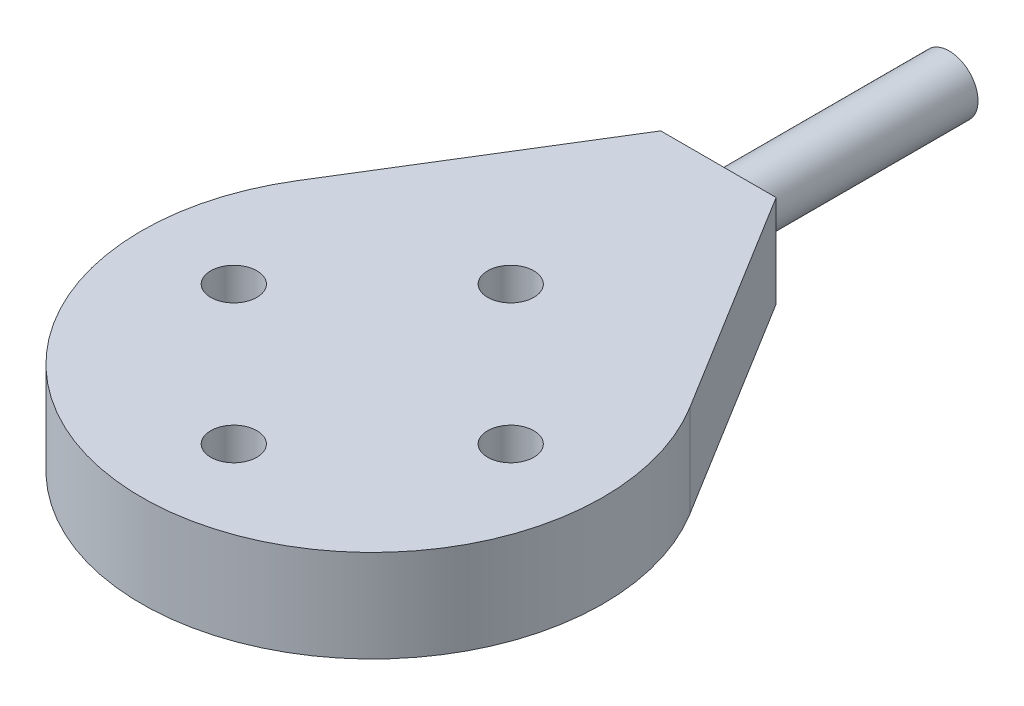
ISO-10303-21;
HEADER;
FILE_DESCRIPTION(('STEP AP214'),'2;1');
FILE_NAME('part.step','',(''),(''),'','','');
FILE_SCHEMA(('AUTOMOTIVE_DESIGN { 1 0 10303 214 1 1 1 1 }'));
ENDSEC;
DATA;
#1=APPLICATION_CONTEXT('core data for automotive mechanical design processes');
#2=APPLICATION_PROTOCOL_DEFINITION('international standard','automotive_design',2000,#1);
#3=PRODUCT_CONTEXT('',#1,'mechanical');
#4=PRODUCT('Part','Part','',(#3));
#5=PRODUCT_RELATED_PRODUCT_CATEGORY('part','',(#4));
#6=PRODUCT_DEFINITION_FORMATION('','',#4);
#7=PRODUCT_DEFINITION_CONTEXT('part definition',#1,'design');
#8=PRODUCT_DEFINITION('design','',#6,#7);
#9=PRODUCT_DEFINITION_SHAPE('','',#8);
#10=(LENGTH_UNIT() NAMED_UNIT(*) SI_UNIT(.MILLI.,.METRE.));
#11=(NAMED_UNIT(*) PLANE_ANGLE_UNIT() SI_UNIT($,.RADIAN.));
#12=(NAMED_UNIT(*) SI_UNIT($,.STERADIAN.) SOLID_ANGLE_UNIT());
#13=UNCERTAINTY_MEASURE_WITH_UNIT(LENGTH_MEASURE(1.E-05),#10,'distance_accuracy_value','');
#14=(GEOMETRIC_REPRESENTATION_CONTEXT(3) GLOBAL_UNCERTAINTY_ASSIGNED_CONTEXT((#13)) GLOBAL_UNIT_ASSIGNED_CONTEXT((#10,
#11,#12)) REPRESENTATION_CONTEXT('',''));
#15=CARTESIAN_POINT('',(0.,0.,0.));
#16=DIRECTION('',(0.,0.,1.));
#17=DIRECTION('',(1.,0.,0.));
#18=AXIS2_PLACEMENT_3D('',#15,#16,#17);
#19=CARTESIAN_POINT('',(0.,5.08,0.));
#20=DIRECTION('',(0.,1.,0.));
#21=DIRECTION('',(0.,0.,1.));
#22=AXIS2_PLACEMENT_3D('',#19,#20,#21);
#23=PLANE('',#22);
#24=CARTESIAN_POINT('',(0.,5.08,7.62));
#25=DIRECTION('',(0.,1.,0.));
#26=DIRECTION('',(0.,0.,1.));
#27=AXIS2_PLACEMENT_3D('',#24,#25,#26);
#28=CIRCLE('',#27,1.27);
#29=CARTESIAN_POINT('',(0.,5.08,8.89));
#30=VERTEX_POINT('',#29);
#31=EDGE_CURVE('E151',#30,#30,#28,.T.);
#32=ORIENTED_EDGE('',*,*,#31,.F.);
#33=EDGE_LOOP('',(#32));
#34=FACE_BOUND('',#33,.T.);
#35=CARTESIAN_POINT('',(0.,5.08,-7.62));
#36=DIRECTION('',(0.,1.,0.));
#37=DIRECTION('',(0.,0.,1.));
#38=AXIS2_PLACEMENT_3D('',#35,#36,#37);
#39=CIRCLE('',#38,1.27);
#40=CARTESIAN_POINT('',(0.,5.08,-6.35));
#41=VERTEX_POINT('',#40);
#42=EDGE_CURVE('E121',#41,#41,#39,.T.);
#43=ORIENTED_EDGE('',*,*,#42,.F.);
#44=EDGE_LOOP('',(#43));
#45=FACE_BOUND('',#44,.T.);
#46=DIRECTION('',(-0.52479525148768,0.,-0.85122849107392));
#47=VECTOR('',#46,1.);
#48=CARTESIAN_POINT('',(3.175,5.08,-19.05));
#49=LINE('',#48,#47);
#50=CARTESIAN_POINT('',(10.8106018366388,5.08,-6.66489969389353));
#51=VERTEX_POINT('',#50);
#52=CARTESIAN_POINT('',(3.175,5.08,-19.05));
#53=VERTEX_POINT('',#52);
#54=EDGE_CURVE('E100',#51,#53,#49,.T.);
#55=ORIENTED_EDGE('',*,*,#54,.T.);
#56=DIRECTION('',(-1.,0.,0.));
#57=VECTOR('',#56,1.);
#58=CARTESIAN_POINT('',(-3.175,5.08,-19.05));
#59=LINE('',#58,#57);
#60=CARTESIAN_POINT('',(-3.175,5.08,-19.05));
#61=VERTEX_POINT('',#60);
#62=EDGE_CURVE('E95',#53,#61,#59,.T.);
#63=ORIENTED_EDGE('',*,*,#62,.T.);
#64=DIRECTION('',(-0.52479525148768,0.,0.85122849107392));
#65=VECTOR('',#64,1.);
#66=CARTESIAN_POINT('',(-10.8106018366388,5.08,-6.66489969389354));
#67=LINE('',#66,#65);
#68=CARTESIAN_POINT('',(-10.8106018366388,5.08,-6.66489969389354));
#69=VERTEX_POINT('',#68);
#70=EDGE_CURVE('E98',#61,#69,#67,.T.);
#71=ORIENTED_EDGE('',*,*,#70,.T.);
#72=CARTESIAN_POINT('',(0.,5.08,0.));
#73=DIRECTION('',(0.,1.,0.));
#74=DIRECTION('',(0.,0.,1.));
#75=AXIS2_PLACEMENT_3D('',#72,#73,#74);
#76=CIRCLE('',#75,12.7);
#77=EDGE_CURVE('E64',#69,#51,#76,.T.);
#78=ORIENTED_EDGE('',*,*,#77,.T.);
#79=EDGE_LOOP('',(#55,#63,#71,#78));
#80=FACE_BOUND('',#79,.T.);
#81=CARTESIAN_POINT('',(7.62,5.08,0.));
#82=DIRECTION('',(0.,1.,0.));
#83=DIRECTION('',(0.,0.,1.));
#84=AXIS2_PLACEMENT_3D('',#81,#82,#83);
#85=CIRCLE('',#84,1.27);
#86=CARTESIAN_POINT('',(7.62,5.08,1.27));
#87=VERTEX_POINT('',#86);
#88=EDGE_CURVE('E143',#87,#87,#85,.T.);
#89=ORIENTED_EDGE('',*,*,#88,.F.);
#90=EDGE_LOOP('',(#89));
#91=FACE_BOUND('',#90,.T.);
#92=CARTESIAN_POINT('',(-7.62,5.08,0.));
#93=DIRECTION('',(0.,1.,0.));
#94=DIRECTION('',(0.,0.,1.));
#95=AXIS2_PLACEMENT_3D('',#92,#93,#94);
#96=CIRCLE('',#95,1.27);
#97=CARTESIAN_POINT('',(-7.62,5.08,1.27));
#98=VERTEX_POINT('',#97);
#99=EDGE_CURVE('E159',#98,#98,#96,.T.);
#100=ORIENTED_EDGE('',*,*,#99,.F.);
#101=EDGE_LOOP('',(#100));
#102=FACE_BOUND('',#101,.T.);
#103=ADVANCED_FACE('F45',(#34,#45,#80,#91,#102),#23,.T.);
#104=CARTESIAN_POINT('',(0.,0.,0.));
#105=DIRECTION('',(0.,1.,0.));
#106=DIRECTION('',(0.,0.,1.));
#107=AXIS2_PLACEMENT_3D('',#104,#105,#106);
#108=PLANE('',#107);
#109=DIRECTION('',(-0.52479525148768,0.,-0.85122849107392));
#110=VECTOR('',#109,1.);
#111=CARTESIAN_POINT('',(3.175,0.,-19.05));
#112=LINE('',#111,#110);
#113=CARTESIAN_POINT('',(10.8106018366388,0.,-6.66489969389353));
#114=VERTEX_POINT('',#113);
#115=CARTESIAN_POINT('',(3.175,0.,-19.05));
#116=VERTEX_POINT('',#115);
#117=EDGE_CURVE('E117',#114,#116,#112,.T.);
#118=ORIENTED_EDGE('',*,*,#117,.F.);
#119=CARTESIAN_POINT('',(0.,0.,0.));
#120=DIRECTION('',(0.,1.,0.));
#121=DIRECTION('',(0.,0.,1.));
#122=AXIS2_PLACEMENT_3D('',#119,#120,#121);
#123=CIRCLE('',#122,12.7);
#124=CARTESIAN_POINT('',(-10.8106018366388,0.,-6.66489969389354));
#125=VERTEX_POINT('',#124);
#126=EDGE_CURVE('E87',#125,#114,#123,.T.);
#127=ORIENTED_EDGE('',*,*,#126,.F.);
#128=DIRECTION('',(-0.52479525148768,0.,0.85122849107392));
#129=VECTOR('',#128,1.);
#130=CARTESIAN_POINT('',(-10.8106018366388,0.,-6.66489969389354));
#131=LINE('',#130,#129);
#132=CARTESIAN_POINT('',(-3.175,0.,-19.05));
#133=VERTEX_POINT('',#132);
#134=EDGE_CURVE('E81',#133,#125,#131,.T.);
#135=ORIENTED_EDGE('',*,*,#134,.F.);
#136=DIRECTION('',(-1.,0.,0.));
#137=VECTOR('',#136,1.);
#138=CARTESIAN_POINT('',(-3.175,0.,-19.05));
#139=LINE('',#138,#137);
#140=EDGE_CURVE('E106',#116,#133,#139,.T.);
#141=ORIENTED_EDGE('',*,*,#140,.F.);
#142=EDGE_LOOP('',(#118,#127,#135,#141));
#143=FACE_BOUND('',#142,.T.);
#144=CARTESIAN_POINT('',(0.,0.,-7.62));
#145=DIRECTION('',(0.,1.,0.));
#146=DIRECTION('',(0.,0.,1.));
#147=AXIS2_PLACEMENT_3D('',#144,#145,#146);
#148=CIRCLE('',#147,1.27);
#149=CARTESIAN_POINT('',(0.,0.,-6.35));
#150=VERTEX_POINT('',#149);
#151=EDGE_CURVE('E139',#150,#150,#148,.T.);
#152=ORIENTED_EDGE('',*,*,#151,.T.);
#153=EDGE_LOOP('',(#152));
#154=FACE_BOUND('',#153,.T.);
#155=CARTESIAN_POINT('',(7.62,0.,0.));
#156=DIRECTION('',(0.,1.,0.));
#157=DIRECTION('',(0.,0.,1.));
#158=AXIS2_PLACEMENT_3D('',#155,#156,#157);
#159=CIRCLE('',#158,1.27);
#160=CARTESIAN_POINT('',(7.62,0.,1.27));
#161=VERTEX_POINT('',#160);
#162=EDGE_CURVE('E147',#161,#161,#159,.T.);
#163=ORIENTED_EDGE('',*,*,#162,.T.);
#164=EDGE_LOOP('',(#163));
#165=FACE_BOUND('',#164,.T.);
#166=CARTESIAN_POINT('',(0.,0.,7.62));
#167=DIRECTION('',(0.,1.,0.));
#168=DIRECTION('',(0.,0.,1.));
#169=AXIS2_PLACEMENT_3D('',#166,#167,#168);
#170=CIRCLE('',#169,1.27);
#171=CARTESIAN_POINT('',(0.,0.,8.89));
#172=VERTEX_POINT('',#171);
#173=EDGE_CURVE('E155',#172,#172,#170,.T.);
#174=ORIENTED_EDGE('',*,*,#173,.T.);
#175=EDGE_LOOP('',(#174));
#176=FACE_BOUND('',#175,.T.);
#177=CARTESIAN_POINT('',(-7.62,0.,0.));
#178=DIRECTION('',(0.,1.,0.));
#179=DIRECTION('',(0.,0.,1.));
#180=AXIS2_PLACEMENT_3D('',#177,#178,#179);
#181=CIRCLE('',#180,1.27);
#182=CARTESIAN_POINT('',(-7.62,0.,1.27));
#183=VERTEX_POINT('',#182);
#184=EDGE_CURVE('E163',#183,#183,#181,.T.);
#185=ORIENTED_EDGE('',*,*,#184,.T.);
#186=EDGE_LOOP('',(#185));
#187=FACE_BOUND('',#186,.T.);
#188=ADVANCED_FACE('F134',(#143,#154,#165,#176,#187),#108,.F.);
#189=CARTESIAN_POINT('',(3.175,5.08,-19.05));
#190=DIRECTION('',(-0.85122849107392,0.,0.52479525148768));
#191=DIRECTION('',(0.52479525148768,0.,0.85122849107392));
#192=AXIS2_PLACEMENT_3D('',#189,#190,#191);
#193=PLANE('',#192);
#194=ORIENTED_EDGE('',*,*,#117,.T.);
#195=DIRECTION('',(0.,-1.,0.));
#196=VECTOR('',#195,1.);
#197=CARTESIAN_POINT('',(3.175,5.08,-19.05));
#198=LINE('',#197,#196);
#199=EDGE_CURVE('E49',#53,#116,#198,.T.);
#200=ORIENTED_EDGE('',*,*,#199,.F.);
#201=ORIENTED_EDGE('',*,*,#54,.F.);
#202=DIRECTION('',(0.,-1.,0.));
#203=VECTOR('',#202,1.);
#204=CARTESIAN_POINT('',(10.8106018366388,5.08,-6.66489969389353));
#205=LINE('',#204,#203);
#206=EDGE_CURVE('E113',#51,#114,#205,.T.);
#207=ORIENTED_EDGE('',*,*,#206,.T.);
#208=EDGE_LOOP('',(#194,#200,#201,#207));
#209=FACE_BOUND('',#208,.T.);
#210=ADVANCED_FACE('F47',(#209),#193,.F.);
#211=CARTESIAN_POINT('',(-3.175,5.08,-19.05));
#212=DIRECTION('',(0.,0.,1.));
#213=DIRECTION('',(1.,0.,0.));
#214=AXIS2_PLACEMENT_3D('',#211,#212,#213);
#215=PLANE('',#214);
#216=CARTESIAN_POINT('',(0.,2.54,-19.05));
#217=DIRECTION('',(0.,0.,-1.));
#218=DIRECTION('',(-1.,0.,0.));
#219=AXIS2_PLACEMENT_3D('',#216,#217,#218);
#220=CIRCLE('',#219,1.5875);
#221=CARTESIAN_POINT('',(-1.5875,2.54,-19.05));
#222=VERTEX_POINT('',#221);
#223=EDGE_CURVE('E11',#222,#222,#220,.T.);
#224=ORIENTED_EDGE('',*,*,#223,.F.);
#225=EDGE_LOOP('',(#224));
#226=FACE_BOUND('',#225,.T.);
#227=ORIENTED_EDGE('',*,*,#140,.T.);
#228=DIRECTION('',(0.,-1.,0.));
#229=VECTOR('',#228,1.);
#230=CARTESIAN_POINT('',(-3.175,5.08,-19.05));
#231=LINE('',#230,#229);
#232=EDGE_CURVE('E104',#61,#133,#231,.T.);
#233=ORIENTED_EDGE('',*,*,#232,.F.);
#234=ORIENTED_EDGE('',*,*,#62,.F.);
#235=ORIENTED_EDGE('',*,*,#199,.T.);
#236=EDGE_LOOP('',(#227,#233,#234,#235));
#237=FACE_BOUND('',#236,.T.);
#238=ADVANCED_FACE('F105',(#226,#237),#215,.F.);
#239=CARTESIAN_POINT('',(-10.8106018366388,5.08,-6.66489969389354));
#240=DIRECTION('',(0.85122849107392,0.,0.52479525148768));
#241=DIRECTION('',(0.52479525148768,0.,-0.85122849107392));
#242=AXIS2_PLACEMENT_3D('',#239,#240,#241);
#243=PLANE('',#242);
#244=ORIENTED_EDGE('',*,*,#134,.T.);
#245=DIRECTION('',(0.,-1.,0.));
#246=VECTOR('',#245,1.);
#247=CARTESIAN_POINT('',(-10.8106018366388,5.08,-6.66489969389354));
#248=LINE('',#247,#246);
#249=EDGE_CURVE('E108',#69,#125,#248,.T.);
#250=ORIENTED_EDGE('',*,*,#249,.F.);
#251=ORIENTED_EDGE('',*,*,#70,.F.);
#252=ORIENTED_EDGE('',*,*,#232,.T.);
#253=EDGE_LOOP('',(#244,#250,#251,#252));
#254=FACE_BOUND('',#253,.T.);
#255=ADVANCED_FACE('F109',(#254),#243,.F.);
#256=CARTESIAN_POINT('',(0.,5.08,0.));
#257=DIRECTION('',(0.,-1.,0.));
#258=DIRECTION('',(0.,0.,-1.));
#259=AXIS2_PLACEMENT_3D('',#256,#257,#258);
#260=CYLINDRICAL_SURFACE('',#259,12.7);
#261=ORIENTED_EDGE('',*,*,#126,.T.);
#262=ORIENTED_EDGE('',*,*,#206,.F.);
#263=ORIENTED_EDGE('',*,*,#77,.F.);
#264=ORIENTED_EDGE('',*,*,#249,.T.);
#265=EDGE_LOOP('',(#261,#262,#263,#264));
#266=FACE_BOUND('',#265,.T.);
#267=ADVANCED_FACE('F131',(#266),#260,.T.);
#268=CARTESIAN_POINT('',(0.,5.08,-7.62));
#269=DIRECTION('',(0.,-1.,0.));
#270=DIRECTION('',(0.,0.,-1.));
#271=AXIS2_PLACEMENT_3D('',#268,#269,#270);
#272=CYLINDRICAL_SURFACE('',#271,1.27);
#273=ORIENTED_EDGE('',*,*,#42,.T.);
#274=EDGE_LOOP('',(#273));
#275=FACE_BOUND('',#274,.T.);
#276=ORIENTED_EDGE('',*,*,#151,.F.);
#277=EDGE_LOOP('',(#276));
#278=FACE_BOUND('',#277,.T.);
#279=ADVANCED_FACE('F201',(#275,#278),#272,.F.);
#280=CARTESIAN_POINT('',(7.62,5.08,0.));
#281=DIRECTION('',(0.,-1.,0.));
#282=DIRECTION('',(0.,0.,-1.));
#283=AXIS2_PLACEMENT_3D('',#280,#281,#282);
#284=CYLINDRICAL_SURFACE('',#283,1.27);
#285=ORIENTED_EDGE('',*,*,#88,.T.);
#286=EDGE_LOOP('',(#285));
#287=FACE_BOUND('',#286,.T.);
#288=ORIENTED_EDGE('',*,*,#162,.F.);
#289=EDGE_LOOP('',(#288));
#290=FACE_BOUND('',#289,.T.);
#291=ADVANCED_FACE('F208',(#287,#290),#284,.F.);
#292=CARTESIAN_POINT('',(0.,5.08,7.62));
#293=DIRECTION('',(0.,-1.,0.));
#294=DIRECTION('',(0.,0.,-1.));
#295=AXIS2_PLACEMENT_3D('',#292,#293,#294);
#296=CYLINDRICAL_SURFACE('',#295,1.27);
#297=ORIENTED_EDGE('',*,*,#31,.T.);
#298=EDGE_LOOP('',(#297));
#299=FACE_BOUND('',#298,.T.);
#300=ORIENTED_EDGE('',*,*,#173,.F.);
#301=EDGE_LOOP('',(#300));
#302=FACE_BOUND('',#301,.T.);
#303=ADVANCED_FACE('F213',(#299,#302),#296,.F.);
#304=CARTESIAN_POINT('',(-7.62,5.08,0.));
#305=DIRECTION('',(0.,-1.,0.));
#306=DIRECTION('',(0.,0.,-1.));
#307=AXIS2_PLACEMENT_3D('',#304,#305,#306);
#308=CYLINDRICAL_SURFACE('',#307,1.27);
#309=ORIENTED_EDGE('',*,*,#99,.T.);
#310=EDGE_LOOP('',(#309));
#311=FACE_BOUND('',#310,.T.);
#312=ORIENTED_EDGE('',*,*,#184,.F.);
#313=EDGE_LOOP('',(#312));
#314=FACE_BOUND('',#313,.T.);
#315=ADVANCED_FACE('F180',(#311,#314),#308,.F.);
#316=CARTESIAN_POINT('',(0.,2.54,-31.75));
#317=DIRECTION('',(0.,0.,1.));
#318=DIRECTION('',(1.,0.,0.));
#319=AXIS2_PLACEMENT_3D('',#316,#317,#318);
#320=CYLINDRICAL_SURFACE('',#319,1.5875);
#321=CARTESIAN_POINT('',(0.,2.54,-31.75));
#322=DIRECTION('',(0.,0.,-1.));
#323=DIRECTION('',(-1.,0.,0.));
#324=AXIS2_PLACEMENT_3D('',#321,#322,#323);
#325=CIRCLE('',#324,1.5875);
#326=CARTESIAN_POINT('',(-1.5875,2.54,-31.75));
#327=VERTEX_POINT('',#326);
#328=EDGE_CURVE('E167',#327,#327,#325,.T.);
#329=ORIENTED_EDGE('',*,*,#328,.F.);
#330=EDGE_LOOP('',(#329));
#331=FACE_BOUND('',#330,.T.);
#332=ORIENTED_EDGE('',*,*,#223,.T.);
#333=EDGE_LOOP('',(#332));
#334=FACE_BOUND('',#333,.T.);
#335=ADVANCED_FACE('F177',(#331,#334),#320,.T.);
#336=CARTESIAN_POINT('',(0.,2.54,-31.75));
#337=DIRECTION('',(0.,0.,-1.));
#338=DIRECTION('',(-1.,0.,0.));
#339=AXIS2_PLACEMENT_3D('',#336,#337,#338);
#340=PLANE('',#339);
#341=ORIENTED_EDGE('',*,*,#328,.T.);
#342=EDGE_LOOP('',(#341));
#343=FACE_BOUND('',#342,.T.);
#344=ADVANCED_FACE('F175',(#343),#340,.T.);
#345=CLOSED_SHELL('',(#103,#188,#210,#238,#255,#267,#279,#291,#303,#315,#335,#344));
#346=MANIFOLD_SOLID_BREP('B2',#345);
#347=ADVANCED_BREP_SHAPE_REPRESENTATION('',(#18,#346),#14);
#348=SHAPE_DEFINITION_REPRESENTATION(#9,#347);
ENDSEC;
END-ISO-10303-21;
